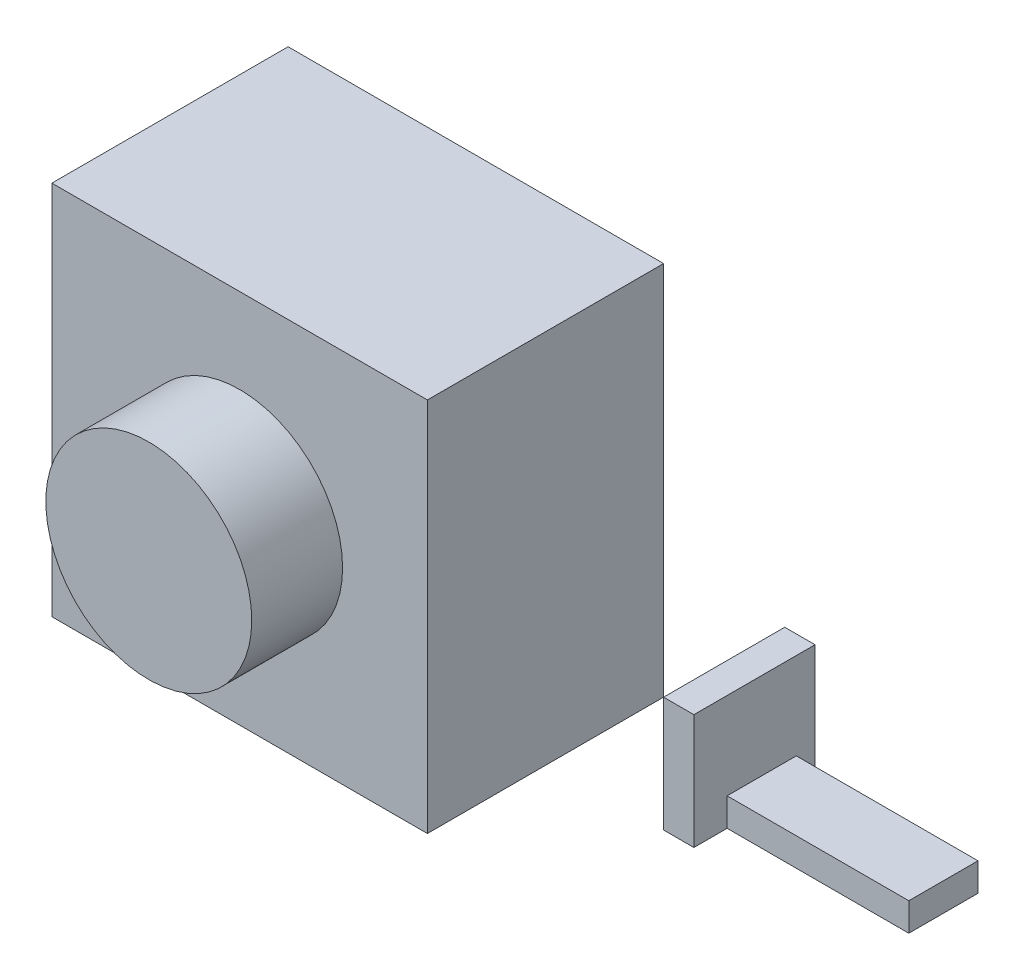
ISO-10303-21;
HEADER;
FILE_DESCRIPTION(('STEP AP214'),'2;1');
FILE_NAME('part.step','',(''),(''),'','','');
FILE_SCHEMA(('AUTOMOTIVE_DESIGN { 1 0 10303 214 1 1 1 1 }'));
ENDSEC;
DATA;
#1=APPLICATION_CONTEXT('core data for automotive mechanical design processes');
#2=APPLICATION_PROTOCOL_DEFINITION('international standard','automotive_design',2000,#1);
#3=PRODUCT_CONTEXT('',#1,'mechanical');
#4=PRODUCT('Part','Part','',(#3));
#5=PRODUCT_RELATED_PRODUCT_CATEGORY('part','',(#4));
#6=PRODUCT_DEFINITION_FORMATION('','',#4);
#7=PRODUCT_DEFINITION_CONTEXT('part definition',#1,'design');
#8=PRODUCT_DEFINITION('design','',#6,#7);
#9=PRODUCT_DEFINITION_SHAPE('','',#8);
#10=(LENGTH_UNIT() NAMED_UNIT(*) SI_UNIT(.MILLI.,.METRE.));
#11=(NAMED_UNIT(*) PLANE_ANGLE_UNIT() SI_UNIT($,.RADIAN.));
#12=(NAMED_UNIT(*) SI_UNIT($,.STERADIAN.) SOLID_ANGLE_UNIT());
#13=UNCERTAINTY_MEASURE_WITH_UNIT(LENGTH_MEASURE(1.E-05),#10,'distance_accuracy_value','');
#14=(GEOMETRIC_REPRESENTATION_CONTEXT(3) GLOBAL_UNCERTAINTY_ASSIGNED_CONTEXT((#13)) GLOBAL_UNIT_ASSIGNED_CONTEXT((#10,
#11,#12)) REPRESENTATION_CONTEXT('',''));
#15=CARTESIAN_POINT('',(0.,0.,0.));
#16=DIRECTION('',(0.,0.,1.));
#17=DIRECTION('',(1.,0.,0.));
#18=AXIS2_PLACEMENT_3D('',#15,#16,#17);
#19=CARTESIAN_POINT('',(-3.1,-1.9,-1.95));
#20=DIRECTION('',(-1.,0.,0.));
#21=DIRECTION('',(0.,0.,1.));
#22=AXIS2_PLACEMENT_3D('',#19,#20,#21);
#23=PLANE('',#22);
#24=DIRECTION('',(0.,0.,1.));
#25=VECTOR('',#24,1.);
#26=CARTESIAN_POINT('',(-3.1,0.,-1.95));
#27=LINE('',#26,#25);
#28=CARTESIAN_POINT('',(-3.1,0.,-3.95));
#29=VERTEX_POINT('',#28);
#30=CARTESIAN_POINT('',(-3.1,0.,-1.95));
#31=VERTEX_POINT('',#30);
#32=EDGE_CURVE('E107',#29,#31,#27,.T.);
#33=ORIENTED_EDGE('',*,*,#32,.T.);
#34=DIRECTION('',(0.,1.,0.));
#35=VECTOR('',#34,1.);
#36=CARTESIAN_POINT('',(-3.1,-1.9,-1.95));
#37=LINE('',#36,#35);
#38=CARTESIAN_POINT('',(-3.1,-1.9,-1.95));
#39=VERTEX_POINT('',#38);
#40=EDGE_CURVE('E12',#39,#31,#37,.T.);
#41=ORIENTED_EDGE('',*,*,#40,.F.);
#42=DIRECTION('',(0.,0.,1.));
#43=VECTOR('',#42,1.);
#44=CARTESIAN_POINT('',(-3.1,-1.9,-1.95));
#45=LINE('',#44,#43);
#46=CARTESIAN_POINT('',(-3.1,-1.9,-3.95));
#47=VERTEX_POINT('',#46);
#48=EDGE_CURVE('E95',#47,#39,#45,.T.);
#49=ORIENTED_EDGE('',*,*,#48,.F.);
#50=DIRECTION('',(0.,1.,0.));
#51=VECTOR('',#50,1.);
#52=CARTESIAN_POINT('',(-3.1,-1.9,-3.95));
#53=LINE('',#52,#51);
#54=EDGE_CURVE('E103',#47,#29,#53,.T.);
#55=ORIENTED_EDGE('',*,*,#54,.T.);
#56=EDGE_LOOP('',(#33,#41,#49,#55));
#57=FACE_BOUND('',#56,.T.);
#58=ADVANCED_FACE('F44',(#57),#23,.F.);
#59=CARTESIAN_POINT('',(-3.1,-1.9,-1.95));
#60=DIRECTION('',(0.,0.,-1.));
#61=DIRECTION('',(-1.,0.,0.));
#62=AXIS2_PLACEMENT_3D('',#59,#60,#61);
#63=PLANE('',#62);
#64=DIRECTION('',(-1.,0.,0.));
#65=VECTOR('',#64,1.);
#66=CARTESIAN_POINT('',(-3.1,0.,-1.95));
#67=LINE('',#66,#65);
#68=CARTESIAN_POINT('',(-3.6,0.,-1.95));
#69=VERTEX_POINT('',#68);
#70=EDGE_CURVE('E99',#31,#69,#67,.T.);
#71=ORIENTED_EDGE('',*,*,#70,.T.);
#72=DIRECTION('',(0.,1.,0.));
#73=VECTOR('',#72,1.);
#74=CARTESIAN_POINT('',(-3.6,-1.9,-1.95));
#75=LINE('',#74,#73);
#76=CARTESIAN_POINT('',(-3.6,-1.9,-1.95));
#77=VERTEX_POINT('',#76);
#78=EDGE_CURVE('E52',#77,#69,#75,.T.);
#79=ORIENTED_EDGE('',*,*,#78,.F.);
#80=DIRECTION('',(-1.,0.,0.));
#81=VECTOR('',#80,1.);
#82=CARTESIAN_POINT('',(-3.1,-1.9,-1.95));
#83=LINE('',#82,#81);
#84=EDGE_CURVE('E90',#39,#77,#83,.T.);
#85=ORIENTED_EDGE('',*,*,#84,.F.);
#86=ORIENTED_EDGE('',*,*,#40,.T.);
#87=EDGE_LOOP('',(#71,#79,#85,#86));
#88=FACE_BOUND('',#87,.T.);
#89=ADVANCED_FACE('F98',(#88),#63,.F.);
#90=CARTESIAN_POINT('',(-3.6,-1.9,-1.95));
#91=DIRECTION('',(1.,0.,0.));
#92=DIRECTION('',(0.,0.,-1.));
#93=AXIS2_PLACEMENT_3D('',#90,#91,#92);
#94=PLANE('',#93);
#95=DIRECTION('',(0.,0.,-1.));
#96=VECTOR('',#95,1.);
#97=CARTESIAN_POINT('',(-3.6,0.,-1.95));
#98=LINE('',#97,#96);
#99=CARTESIAN_POINT('',(-3.6,0.,-3.95));
#100=VERTEX_POINT('',#99);
#101=EDGE_CURVE('E77',#69,#100,#98,.T.);
#102=ORIENTED_EDGE('',*,*,#101,.T.);
#103=DIRECTION('',(0.,1.,0.));
#104=VECTOR('',#103,1.);
#105=CARTESIAN_POINT('',(-3.6,-1.9,-3.95));
#106=LINE('',#105,#104);
#107=CARTESIAN_POINT('',(-3.6,-1.9,-3.95));
#108=VERTEX_POINT('',#107);
#109=EDGE_CURVE('E100',#108,#100,#106,.T.);
#110=ORIENTED_EDGE('',*,*,#109,.F.);
#111=DIRECTION('',(0.,0.,-1.));
#112=VECTOR('',#111,1.);
#113=CARTESIAN_POINT('',(-3.6,-1.9,-1.95));
#114=LINE('',#113,#112);
#115=EDGE_CURVE('E93',#77,#108,#114,.T.);
#116=ORIENTED_EDGE('',*,*,#115,.F.);
#117=ORIENTED_EDGE('',*,*,#78,.T.);
#118=EDGE_LOOP('',(#102,#110,#116,#117));
#119=FACE_BOUND('',#118,.T.);
#120=ADVANCED_FACE('F101',(#119),#94,.F.);
#121=CARTESIAN_POINT('',(-3.1,-1.9,-3.95));
#122=DIRECTION('',(0.,0.,1.));
#123=DIRECTION('',(1.,0.,0.));
#124=AXIS2_PLACEMENT_3D('',#121,#122,#123);
#125=PLANE('',#124);
#126=DIRECTION('',(1.,0.,0.));
#127=VECTOR('',#126,1.);
#128=CARTESIAN_POINT('',(-3.1,0.,-3.95));
#129=LINE('',#128,#127);
#130=EDGE_CURVE('E83',#100,#29,#129,.T.);
#131=ORIENTED_EDGE('',*,*,#130,.T.);
#132=ORIENTED_EDGE('',*,*,#54,.F.);
#133=DIRECTION('',(1.,0.,0.));
#134=VECTOR('',#133,1.);
#135=CARTESIAN_POINT('',(-3.1,-1.9,-3.95));
#136=LINE('',#135,#134);
#137=EDGE_CURVE('E60',#108,#47,#136,.T.);
#138=ORIENTED_EDGE('',*,*,#137,.F.);
#139=ORIENTED_EDGE('',*,*,#109,.T.);
#140=EDGE_LOOP('',(#131,#132,#138,#139));
#141=FACE_BOUND('',#140,.T.);
#142=ADVANCED_FACE('F114',(#141),#125,.F.);
#143=CARTESIAN_POINT('',(0.,-1.9,0.));
#144=DIRECTION('',(0.,1.,0.));
#145=DIRECTION('',(0.,0.,1.));
#146=AXIS2_PLACEMENT_3D('',#143,#144,#145);
#147=PLANE('',#146);
#148=ORIENTED_EDGE('',*,*,#48,.T.);
#149=ORIENTED_EDGE('',*,*,#84,.T.);
#150=ORIENTED_EDGE('',*,*,#115,.T.);
#151=ORIENTED_EDGE('',*,*,#137,.T.);
#152=EDGE_LOOP('',(#148,#149,#150,#151));
#153=FACE_BOUND('',#152,.T.);
#154=ADVANCED_FACE('F91',(#153),#147,.F.);
#155=CARTESIAN_POINT('',(0.,0.,0.));
#156=DIRECTION('',(0.,1.,0.));
#157=DIRECTION('',(0.,0.,1.));
#158=AXIS2_PLACEMENT_3D('',#155,#156,#157);
#159=PLANE('',#158);
#160=ORIENTED_EDGE('',*,*,#32,.F.);
#161=ORIENTED_EDGE('',*,*,#130,.F.);
#162=ORIENTED_EDGE('',*,*,#101,.F.);
#163=ORIENTED_EDGE('',*,*,#70,.F.);
#164=EDGE_LOOP('',(#160,#161,#162,#163));
#165=FACE_BOUND('',#164,.T.);
#166=ADVANCED_FACE('F117',(#165),#159,.T.);
#167=CLOSED_SHELL('',(#58,#89,#120,#142,#154,#166));
#168=MANIFOLD_SOLID_BREP('B2',#167);
#169=CARTESIAN_POINT('',(3.6,-1.9,-1.95));
#170=DIRECTION('',(-1.,0.,0.));
#171=DIRECTION('',(0.,0.,1.));
#172=AXIS2_PLACEMENT_3D('',#169,#170,#171);
#173=PLANE('',#172);
#174=DIRECTION('',(0.,-1.,0.));
#175=VECTOR('',#174,1.);
#176=CARTESIAN_POINT('',(3.6,-1.43504288082852,-2.49852493988101));
#177=LINE('',#176,#175);
#178=CARTESIAN_POINT('',(3.6,-1.43504288082852,-2.49852493988101));
#179=VERTEX_POINT('',#178);
#180=CARTESIAN_POINT('',(3.6,-1.9,-2.49852493988101));
#181=VERTEX_POINT('',#180);
#182=EDGE_CURVE('E192',#179,#181,#177,.T.);
#183=ORIENTED_EDGE('',*,*,#182,.F.);
#184=DIRECTION('',(0.,0.,1.));
#185=VECTOR('',#184,1.);
#186=CARTESIAN_POINT('',(3.6,-1.43504288082852,-2.49852493988101));
#187=LINE('',#186,#185);
#188=CARTESIAN_POINT('',(3.6,-1.43504288082852,-3.64079431005848));
#189=VERTEX_POINT('',#188);
#190=EDGE_CURVE('E261',#189,#179,#187,.T.);
#191=ORIENTED_EDGE('',*,*,#190,.F.);
#192=DIRECTION('',(0.,1.,0.));
#193=VECTOR('',#192,1.);
#194=CARTESIAN_POINT('',(3.6,-1.43504288082852,-3.64079431005848));
#195=LINE('',#194,#193);
#196=CARTESIAN_POINT('',(3.6,-1.9,-3.64079431005848));
#197=VERTEX_POINT('',#196);
#198=EDGE_CURVE('E397',#197,#189,#195,.T.);
#199=ORIENTED_EDGE('',*,*,#198,.F.);
#200=DIRECTION('',(0.,0.,1.));
#201=VECTOR('',#200,1.);
#202=CARTESIAN_POINT('',(3.6,-1.9,-1.95));
#203=LINE('',#202,#201);
#204=CARTESIAN_POINT('',(3.6,-1.9,-3.95));
#205=VERTEX_POINT('',#204);
#206=EDGE_CURVE('E278',#205,#197,#203,.T.);
#207=ORIENTED_EDGE('',*,*,#206,.F.);
#208=DIRECTION('',(0.,1.,0.));
#209=VECTOR('',#208,1.);
#210=CARTESIAN_POINT('',(3.6,-1.9,-3.95));
#211=LINE('',#210,#209);
#212=CARTESIAN_POINT('',(3.6,0.,-3.95));
#213=VERTEX_POINT('',#212);
#214=EDGE_CURVE('E185',#205,#213,#211,.T.);
#215=ORIENTED_EDGE('',*,*,#214,.T.);
#216=DIRECTION('',(0.,0.,1.));
#217=VECTOR('',#216,1.);
#218=CARTESIAN_POINT('',(3.6,0.,-1.95));
#219=LINE('',#218,#217);
#220=CARTESIAN_POINT('',(3.6,0.,-1.95));
#221=VERTEX_POINT('',#220);
#222=EDGE_CURVE('E284',#213,#221,#219,.T.);
#223=ORIENTED_EDGE('',*,*,#222,.T.);
#224=DIRECTION('',(0.,1.,0.));
#225=VECTOR('',#224,1.);
#226=CARTESIAN_POINT('',(3.6,-1.9,-1.95));
#227=LINE('',#226,#225);
#228=CARTESIAN_POINT('',(3.6,-1.9,-1.95));
#229=VERTEX_POINT('',#228);
#230=EDGE_CURVE('E289',#229,#221,#227,.T.);
#231=ORIENTED_EDGE('',*,*,#230,.F.);
#232=EDGE_CURVE('E197',#181,#229,#203,.T.);
#233=ORIENTED_EDGE('',*,*,#232,.F.);
#234=EDGE_LOOP('',(#183,#191,#199,#207,#215,#223,#231,#233));
#235=FACE_BOUND('',#234,.T.);
#236=ADVANCED_FACE('F177',(#235),#173,.F.);
#237=CARTESIAN_POINT('',(3.1,-1.9,-1.95));
#238=DIRECTION('',(1.,0.,0.));
#239=DIRECTION('',(0.,0.,-1.));
#240=AXIS2_PLACEMENT_3D('',#237,#238,#239);
#241=PLANE('',#240);
#242=DIRECTION('',(0.,0.,-1.));
#243=VECTOR('',#242,1.);
#244=CARTESIAN_POINT('',(3.1,0.,-1.95));
#245=LINE('',#244,#243);
#246=CARTESIAN_POINT('',(3.1,0.,-1.95));
#247=VERTEX_POINT('',#246);
#248=CARTESIAN_POINT('',(3.1,0.,-3.95));
#249=VERTEX_POINT('',#248);
#250=EDGE_CURVE('E264',#247,#249,#245,.T.);
#251=ORIENTED_EDGE('',*,*,#250,.T.);
#252=DIRECTION('',(0.,1.,0.));
#253=VECTOR('',#252,1.);
#254=CARTESIAN_POINT('',(3.1,-1.9,-3.95));
#255=LINE('',#254,#253);
#256=CARTESIAN_POINT('',(3.1,-1.9,-3.95));
#257=VERTEX_POINT('',#256);
#258=EDGE_CURVE('E42',#257,#249,#255,.T.);
#259=ORIENTED_EDGE('',*,*,#258,.F.);
#260=DIRECTION('',(0.,0.,-1.));
#261=VECTOR('',#260,1.);
#262=CARTESIAN_POINT('',(3.1,-1.9,-1.95));
#263=LINE('',#262,#261);
#264=CARTESIAN_POINT('',(3.1,-1.9,-1.95));
#265=VERTEX_POINT('',#264);
#266=EDGE_CURVE('E273',#265,#257,#263,.T.);
#267=ORIENTED_EDGE('',*,*,#266,.F.);
#268=DIRECTION('',(0.,1.,0.));
#269=VECTOR('',#268,1.);
#270=CARTESIAN_POINT('',(3.1,-1.9,-1.95));
#271=LINE('',#270,#269);
#272=EDGE_CURVE('E281',#265,#247,#271,.T.);
#273=ORIENTED_EDGE('',*,*,#272,.T.);
#274=EDGE_LOOP('',(#251,#259,#267,#273));
#275=FACE_BOUND('',#274,.T.);
#276=ADVANCED_FACE('F179',(#275),#241,.F.);
#277=CARTESIAN_POINT('',(3.1,-1.9,-3.95));
#278=DIRECTION('',(0.,0.,1.));
#279=DIRECTION('',(1.,0.,0.));
#280=AXIS2_PLACEMENT_3D('',#277,#278,#279);
#281=PLANE('',#280);
#282=DIRECTION('',(1.,0.,0.));
#283=VECTOR('',#282,1.);
#284=CARTESIAN_POINT('',(3.1,0.,-3.95));
#285=LINE('',#284,#283);
#286=EDGE_CURVE('E267',#249,#213,#285,.T.);
#287=ORIENTED_EDGE('',*,*,#286,.T.);
#288=ORIENTED_EDGE('',*,*,#214,.F.);
#289=DIRECTION('',(1.,0.,0.));
#290=VECTOR('',#289,1.);
#291=CARTESIAN_POINT('',(3.1,-1.9,-3.95));
#292=LINE('',#291,#290);
#293=EDGE_CURVE('E275',#257,#205,#292,.T.);
#294=ORIENTED_EDGE('',*,*,#293,.F.);
#295=ORIENTED_EDGE('',*,*,#258,.T.);
#296=EDGE_LOOP('',(#287,#288,#294,#295));
#297=FACE_BOUND('',#296,.T.);
#298=ADVANCED_FACE('F307',(#297),#281,.F.);
#299=CARTESIAN_POINT('',(3.1,-1.9,-1.95));
#300=DIRECTION('',(0.,0.,-1.));
#301=DIRECTION('',(-1.,0.,0.));
#302=AXIS2_PLACEMENT_3D('',#299,#300,#301);
#303=PLANE('',#302);
#304=DIRECTION('',(-1.,0.,0.));
#305=VECTOR('',#304,1.);
#306=CARTESIAN_POINT('',(3.1,0.,-1.95));
#307=LINE('',#306,#305);
#308=EDGE_CURVE('E276',#221,#247,#307,.T.);
#309=ORIENTED_EDGE('',*,*,#308,.T.);
#310=ORIENTED_EDGE('',*,*,#272,.F.);
#311=DIRECTION('',(-1.,0.,0.));
#312=VECTOR('',#311,1.);
#313=CARTESIAN_POINT('',(3.1,-1.9,-1.95));
#314=LINE('',#313,#312);
#315=EDGE_CURVE('E280',#229,#265,#314,.T.);
#316=ORIENTED_EDGE('',*,*,#315,.F.);
#317=ORIENTED_EDGE('',*,*,#230,.T.);
#318=EDGE_LOOP('',(#309,#310,#316,#317));
#319=FACE_BOUND('',#318,.T.);
#320=ADVANCED_FACE('F302',(#319),#303,.F.);
#321=CARTESIAN_POINT('',(0.,-1.9,0.));
#322=DIRECTION('',(0.,-1.,0.));
#323=DIRECTION('',(0.,0.,-1.));
#324=AXIS2_PLACEMENT_3D('',#321,#322,#323);
#325=PLANE('',#324);
#326=ORIENTED_EDGE('',*,*,#266,.T.);
#327=ORIENTED_EDGE('',*,*,#293,.T.);
#328=ORIENTED_EDGE('',*,*,#206,.T.);
#329=DIRECTION('',(-1.,0.,0.));
#330=VECTOR('',#329,1.);
#331=CARTESIAN_POINT('',(6.6,-1.9,-3.64079431005848));
#332=LINE('',#331,#330);
#333=CARTESIAN_POINT('',(6.6,-1.9,-3.64079431005848));
#334=VERTEX_POINT('',#333);
#335=EDGE_CURVE('E248',#334,#197,#332,.T.);
#336=ORIENTED_EDGE('',*,*,#335,.F.);
#337=DIRECTION('',(0.,0.,-1.));
#338=VECTOR('',#337,1.);
#339=CARTESIAN_POINT('',(6.6,-1.9,-2.49852493988101));
#340=LINE('',#339,#338);
#341=CARTESIAN_POINT('',(6.6,-1.9,-2.49852493988101));
#342=VERTEX_POINT('',#341);
#343=EDGE_CURVE('E240',#342,#334,#340,.T.);
#344=ORIENTED_EDGE('',*,*,#343,.F.);
#345=DIRECTION('',(-1.,0.,0.));
#346=VECTOR('',#345,1.);
#347=CARTESIAN_POINT('',(6.6,-1.9,-2.49852493988101));
#348=LINE('',#347,#346);
#349=EDGE_CURVE('E245',#342,#181,#348,.T.);
#350=ORIENTED_EDGE('',*,*,#349,.T.);
#351=ORIENTED_EDGE('',*,*,#232,.T.);
#352=ORIENTED_EDGE('',*,*,#315,.T.);
#353=EDGE_LOOP('',(#326,#327,#328,#336,#344,#350,#351,#352));
#354=FACE_BOUND('',#353,.T.);
#355=ADVANCED_FACE('F243',(#354),#325,.T.);
#356=CARTESIAN_POINT('',(0.,0.,0.));
#357=DIRECTION('',(0.,-1.,0.));
#358=DIRECTION('',(0.,0.,-1.));
#359=AXIS2_PLACEMENT_3D('',#356,#357,#358);
#360=PLANE('',#359);
#361=ORIENTED_EDGE('',*,*,#250,.F.);
#362=ORIENTED_EDGE('',*,*,#308,.F.);
#363=ORIENTED_EDGE('',*,*,#222,.F.);
#364=ORIENTED_EDGE('',*,*,#286,.F.);
#365=EDGE_LOOP('',(#361,#362,#363,#364));
#366=FACE_BOUND('',#365,.T.);
#367=ADVANCED_FACE('F299',(#366),#360,.F.);
#368=CARTESIAN_POINT('',(6.6,-1.43504288082852,-2.49852493988101));
#369=DIRECTION('',(0.,0.,-1.));
#370=DIRECTION('',(-1.,0.,0.));
#371=AXIS2_PLACEMENT_3D('',#368,#369,#370);
#372=PLANE('',#371);
#373=ORIENTED_EDGE('',*,*,#182,.T.);
#374=ORIENTED_EDGE('',*,*,#349,.F.);
#375=DIRECTION('',(0.,-1.,0.));
#376=VECTOR('',#375,1.);
#377=CARTESIAN_POINT('',(6.6,-1.43504288082852,-2.49852493988101));
#378=LINE('',#377,#376);
#379=CARTESIAN_POINT('',(6.6,-1.43504288082852,-2.49852493988101));
#380=VERTEX_POINT('',#379);
#381=EDGE_CURVE('E252',#380,#342,#378,.T.);
#382=ORIENTED_EDGE('',*,*,#381,.F.);
#383=DIRECTION('',(-1.,0.,0.));
#384=VECTOR('',#383,1.);
#385=CARTESIAN_POINT('',(6.6,-1.43504288082852,-2.49852493988101));
#386=LINE('',#385,#384);
#387=EDGE_CURVE('E394',#380,#179,#386,.T.);
#388=ORIENTED_EDGE('',*,*,#387,.T.);
#389=EDGE_LOOP('',(#373,#374,#382,#388));
#390=FACE_BOUND('',#389,.T.);
#391=ADVANCED_FACE('F263',(#390),#372,.F.);
#392=CARTESIAN_POINT('',(6.6,-1.43504288082852,-3.64079431005848));
#393=DIRECTION('',(0.,0.,1.));
#394=DIRECTION('',(1.,0.,0.));
#395=AXIS2_PLACEMENT_3D('',#392,#393,#394);
#396=PLANE('',#395);
#397=ORIENTED_EDGE('',*,*,#198,.T.);
#398=DIRECTION('',(-1.,0.,0.));
#399=VECTOR('',#398,1.);
#400=CARTESIAN_POINT('',(6.6,-1.43504288082852,-3.64079431005848));
#401=LINE('',#400,#399);
#402=CARTESIAN_POINT('',(6.6,-1.43504288082852,-3.64079431005848));
#403=VERTEX_POINT('',#402);
#404=EDGE_CURVE('E269',#403,#189,#401,.T.);
#405=ORIENTED_EDGE('',*,*,#404,.F.);
#406=DIRECTION('',(0.,1.,0.));
#407=VECTOR('',#406,1.);
#408=CARTESIAN_POINT('',(6.6,-1.43504288082852,-3.64079431005848));
#409=LINE('',#408,#407);
#410=EDGE_CURVE('E251',#334,#403,#409,.T.);
#411=ORIENTED_EDGE('',*,*,#410,.F.);
#412=ORIENTED_EDGE('',*,*,#335,.T.);
#413=EDGE_LOOP('',(#397,#405,#411,#412));
#414=FACE_BOUND('',#413,.T.);
#415=ADVANCED_FACE('F325',(#414),#396,.F.);
#416=CARTESIAN_POINT('',(6.6,-1.43504288082852,-2.49852493988101));
#417=DIRECTION('',(0.,-1.,0.));
#418=DIRECTION('',(0.,0.,-1.));
#419=AXIS2_PLACEMENT_3D('',#416,#417,#418);
#420=PLANE('',#419);
#421=ORIENTED_EDGE('',*,*,#190,.T.);
#422=ORIENTED_EDGE('',*,*,#387,.F.);
#423=DIRECTION('',(0.,0.,1.));
#424=VECTOR('',#423,1.);
#425=CARTESIAN_POINT('',(6.6,-1.43504288082852,-2.49852493988101));
#426=LINE('',#425,#424);
#427=EDGE_CURVE('E257',#403,#380,#426,.T.);
#428=ORIENTED_EDGE('',*,*,#427,.F.);
#429=ORIENTED_EDGE('',*,*,#404,.T.);
#430=EDGE_LOOP('',(#421,#422,#428,#429));
#431=FACE_BOUND('',#430,.T.);
#432=ADVANCED_FACE('F328',(#431),#420,.F.);
#433=CARTESIAN_POINT('',(6.6,0.,0.));
#434=DIRECTION('',(1.,0.,0.));
#435=DIRECTION('',(0.,0.,-1.));
#436=AXIS2_PLACEMENT_3D('',#433,#434,#435);
#437=PLANE('',#436);
#438=ORIENTED_EDGE('',*,*,#381,.T.);
#439=ORIENTED_EDGE('',*,*,#343,.T.);
#440=ORIENTED_EDGE('',*,*,#410,.T.);
#441=ORIENTED_EDGE('',*,*,#427,.T.);
#442=EDGE_LOOP('',(#438,#439,#440,#441));
#443=FACE_BOUND('',#442,.T.);
#444=ADVANCED_FACE('F255',(#443),#437,.T.);
#445=CLOSED_SHELL('',(#236,#276,#298,#320,#355,#367,#391,#415,#432,#444));
#446=MANIFOLD_SOLID_BREP('B6',#445);
#447=CARTESIAN_POINT('',(3.1,6.2,1.95));
#448=DIRECTION('',(-1.,0.,0.));
#449=DIRECTION('',(0.,0.,1.));
#450=AXIS2_PLACEMENT_3D('',#447,#448,#449);
#451=PLANE('',#450);
#452=DIRECTION('',(0.,0.,-1.));
#453=VECTOR('',#452,1.);
#454=CARTESIAN_POINT('',(3.1,0.,1.95));
#455=LINE('',#454,#453);
#456=CARTESIAN_POINT('',(3.1,0.,1.95));
#457=VERTEX_POINT('',#456);
#458=CARTESIAN_POINT('',(3.1,0.,-1.95));
#459=VERTEX_POINT('',#458);
#460=EDGE_CURVE('E473',#457,#459,#455,.T.);
#461=ORIENTED_EDGE('',*,*,#460,.T.);
#462=DIRECTION('',(0.,-1.,0.));
#463=VECTOR('',#462,1.);
#464=CARTESIAN_POINT('',(3.1,6.2,-1.95));
#465=LINE('',#464,#463);
#466=CARTESIAN_POINT('',(3.1,6.2,-1.95));
#467=VERTEX_POINT('',#466);
#468=EDGE_CURVE('E410',#467,#459,#465,.T.);
#469=ORIENTED_EDGE('',*,*,#468,.F.);
#470=DIRECTION('',(0.,0.,-1.));
#471=VECTOR('',#470,1.);
#472=CARTESIAN_POINT('',(3.1,6.2,1.95));
#473=LINE('',#472,#471);
#474=CARTESIAN_POINT('',(3.1,6.2,1.95));
#475=VERTEX_POINT('',#474);
#476=EDGE_CURVE('E460',#475,#467,#473,.T.);
#477=ORIENTED_EDGE('',*,*,#476,.F.);
#478=DIRECTION('',(0.,-1.,0.));
#479=VECTOR('',#478,1.);
#480=CARTESIAN_POINT('',(3.1,6.2,1.95));
#481=LINE('',#480,#479);
#482=EDGE_CURVE('E469',#475,#457,#481,.T.);
#483=ORIENTED_EDGE('',*,*,#482,.T.);
#484=EDGE_LOOP('',(#461,#469,#477,#483));
#485=FACE_BOUND('',#484,.T.);
#486=ADVANCED_FACE('F407',(#485),#451,.F.);
#487=CARTESIAN_POINT('',(-3.1,6.2,-1.95));
#488=DIRECTION('',(0.,0.,1.));
#489=DIRECTION('',(1.,0.,0.));
#490=AXIS2_PLACEMENT_3D('',#487,#488,#489);
#491=PLANE('',#490);
#492=DIRECTION('',(-1.,0.,0.));
#493=VECTOR('',#492,1.);
#494=CARTESIAN_POINT('',(-3.1,0.,-1.95));
#495=LINE('',#494,#493);
#496=CARTESIAN_POINT('',(-3.1,0.,-1.95));
#497=VERTEX_POINT('',#496);
#498=EDGE_CURVE('E465',#459,#497,#495,.T.);
#499=ORIENTED_EDGE('',*,*,#498,.T.);
#500=DIRECTION('',(0.,-1.,0.));
#501=VECTOR('',#500,1.);
#502=CARTESIAN_POINT('',(-3.1,6.2,-1.95));
#503=LINE('',#502,#501);
#504=CARTESIAN_POINT('',(-3.1,6.2,-1.95));
#505=VERTEX_POINT('',#504);
#506=EDGE_CURVE('E463',#505,#497,#503,.T.);
#507=ORIENTED_EDGE('',*,*,#506,.F.);
#508=DIRECTION('',(-1.,0.,0.));
#509=VECTOR('',#508,1.);
#510=CARTESIAN_POINT('',(-3.1,6.2,-1.95));
#511=LINE('',#510,#509);
#512=EDGE_CURVE('E455',#467,#505,#511,.T.);
#513=ORIENTED_EDGE('',*,*,#512,.F.);
#514=ORIENTED_EDGE('',*,*,#468,.T.);
#515=EDGE_LOOP('',(#499,#507,#513,#514));
#516=FACE_BOUND('',#515,.T.);
#517=ADVANCED_FACE('F464',(#516),#491,.F.);
#518=CARTESIAN_POINT('',(-3.1,6.2,1.95));
#519=DIRECTION('',(1.,0.,0.));
#520=DIRECTION('',(0.,0.,-1.));
#521=AXIS2_PLACEMENT_3D('',#518,#519,#520);
#522=PLANE('',#521);
#523=DIRECTION('',(0.,0.,1.));
#524=VECTOR('',#523,1.);
#525=CARTESIAN_POINT('',(-3.1,0.,1.95));
#526=LINE('',#525,#524);
#527=CARTESIAN_POINT('',(-3.1,0.,1.95));
#528=VERTEX_POINT('',#527);
#529=EDGE_CURVE('E441',#497,#528,#526,.T.);
#530=ORIENTED_EDGE('',*,*,#529,.T.);
#531=DIRECTION('',(0.,-1.,0.));
#532=VECTOR('',#531,1.);
#533=CARTESIAN_POINT('',(-3.1,6.2,1.95));
#534=LINE('',#533,#532);
#535=CARTESIAN_POINT('',(-3.1,6.2,1.95));
#536=VERTEX_POINT('',#535);
#537=EDGE_CURVE('E466',#536,#528,#534,.T.);
#538=ORIENTED_EDGE('',*,*,#537,.F.);
#539=DIRECTION('',(0.,0.,1.));
#540=VECTOR('',#539,1.);
#541=CARTESIAN_POINT('',(-3.1,6.2,1.95));
#542=LINE('',#541,#540);
#543=EDGE_CURVE('E458',#505,#536,#542,.T.);
#544=ORIENTED_EDGE('',*,*,#543,.F.);
#545=ORIENTED_EDGE('',*,*,#506,.T.);
#546=EDGE_LOOP('',(#530,#538,#544,#545));
#547=FACE_BOUND('',#546,.T.);
#548=ADVANCED_FACE('F467',(#547),#522,.F.);
#549=CARTESIAN_POINT('',(-3.1,6.2,1.95));
#550=DIRECTION('',(0.,0.,-1.));
#551=DIRECTION('',(-1.,0.,0.));
#552=AXIS2_PLACEMENT_3D('',#549,#550,#551);
#553=PLANE('',#552);
#554=CARTESIAN_POINT('',(0.,3.1,1.95));
#555=DIRECTION('',(0.,0.,1.));
#556=DIRECTION('',(1.,0.,0.));
#557=AXIS2_PLACEMENT_3D('',#554,#555,#556);
#558=CIRCLE('',#557,1.7);
#559=CARTESIAN_POINT('',(1.7,3.1,1.95));
#560=VERTEX_POINT('',#559);
#561=EDGE_CURVE('E175',#560,#560,#558,.T.);
#562=ORIENTED_EDGE('',*,*,#561,.F.);
#563=EDGE_LOOP('',(#562));
#564=FACE_BOUND('',#563,.T.);
#565=DIRECTION('',(1.,0.,0.));
#566=VECTOR('',#565,1.);
#567=CARTESIAN_POINT('',(-3.1,0.,1.95));
#568=LINE('',#567,#566);
#569=EDGE_CURVE('E447',#528,#457,#568,.T.);
#570=ORIENTED_EDGE('',*,*,#569,.T.);
#571=ORIENTED_EDGE('',*,*,#482,.F.);
#572=DIRECTION('',(1.,0.,0.));
#573=VECTOR('',#572,1.);
#574=CARTESIAN_POINT('',(-3.1,6.2,1.95));
#575=LINE('',#574,#573);
#576=EDGE_CURVE('E424',#536,#475,#575,.T.);
#577=ORIENTED_EDGE('',*,*,#576,.F.);
#578=ORIENTED_EDGE('',*,*,#537,.T.);
#579=EDGE_LOOP('',(#570,#571,#577,#578));
#580=FACE_BOUND('',#579,.T.);
#581=ADVANCED_FACE('F481',(#564,#580),#553,.F.);
#582=CARTESIAN_POINT('',(0.,6.2,0.));
#583=DIRECTION('',(0.,-1.,0.));
#584=DIRECTION('',(0.,0.,-1.));
#585=AXIS2_PLACEMENT_3D('',#582,#583,#584);
#586=PLANE('',#585);
#587=ORIENTED_EDGE('',*,*,#476,.T.);
#588=ORIENTED_EDGE('',*,*,#512,.T.);
#589=ORIENTED_EDGE('',*,*,#543,.T.);
#590=ORIENTED_EDGE('',*,*,#576,.T.);
#591=EDGE_LOOP('',(#587,#588,#589,#590));
#592=FACE_BOUND('',#591,.T.);
#593=ADVANCED_FACE('F456',(#592),#586,.F.);
#594=CARTESIAN_POINT('',(0.,0.,0.));
#595=DIRECTION('',(0.,-1.,0.));
#596=DIRECTION('',(0.,0.,-1.));
#597=AXIS2_PLACEMENT_3D('',#594,#595,#596);
#598=PLANE('',#597);
#599=ORIENTED_EDGE('',*,*,#460,.F.);
#600=ORIENTED_EDGE('',*,*,#569,.F.);
#601=ORIENTED_EDGE('',*,*,#529,.F.);
#602=ORIENTED_EDGE('',*,*,#498,.F.);
#603=EDGE_LOOP('',(#599,#600,#601,#602));
#604=FACE_BOUND('',#603,.T.);
#605=ADVANCED_FACE('F484',(#604),#598,.T.);
#606=CARTESIAN_POINT('',(0.,3.1,3.45));
#607=DIRECTION('',(0.,0.,-1.));
#608=DIRECTION('',(-1.,0.,0.));
#609=AXIS2_PLACEMENT_3D('',#606,#607,#608);
#610=CYLINDRICAL_SURFACE('',#609,1.7);
#611=CARTESIAN_POINT('',(0.,3.1,3.45));
#612=DIRECTION('',(0.,0.,1.));
#613=DIRECTION('',(1.,0.,0.));
#614=AXIS2_PLACEMENT_3D('',#611,#612,#613);
#615=CIRCLE('',#614,1.7);
#616=CARTESIAN_POINT('',(1.7,3.1,3.45));
#617=VERTEX_POINT('',#616);
#618=EDGE_CURVE('E476',#617,#617,#615,.T.);
#619=ORIENTED_EDGE('',*,*,#618,.F.);
#620=EDGE_LOOP('',(#619));
#621=FACE_BOUND('',#620,.T.);
#622=ORIENTED_EDGE('',*,*,#561,.T.);
#623=EDGE_LOOP('',(#622));
#624=FACE_BOUND('',#623,.T.);
#625=ADVANCED_FACE('F492',(#621,#624),#610,.T.);
#626=CARTESIAN_POINT('',(0.,3.1,3.45));
#627=DIRECTION('',(0.,0.,1.));
#628=DIRECTION('',(1.,0.,0.));
#629=AXIS2_PLACEMENT_3D('',#626,#627,#628);
#630=PLANE('',#629);
#631=ORIENTED_EDGE('',*,*,#618,.T.);
#632=EDGE_LOOP('',(#631));
#633=FACE_BOUND('',#632,.T.);
#634=ADVANCED_FACE('F490',(#633),#630,.T.);
#635=CLOSED_SHELL('',(#486,#517,#548,#581,#593,#605,#625,#634));
#636=MANIFOLD_SOLID_BREP('B36',#635);
#637=ADVANCED_BREP_SHAPE_REPRESENTATION('',(#18,#168,#446,#636),#14);
#638=SHAPE_DEFINITION_REPRESENTATION(#9,#637);
ENDSEC;
END-ISO-10303-21;
